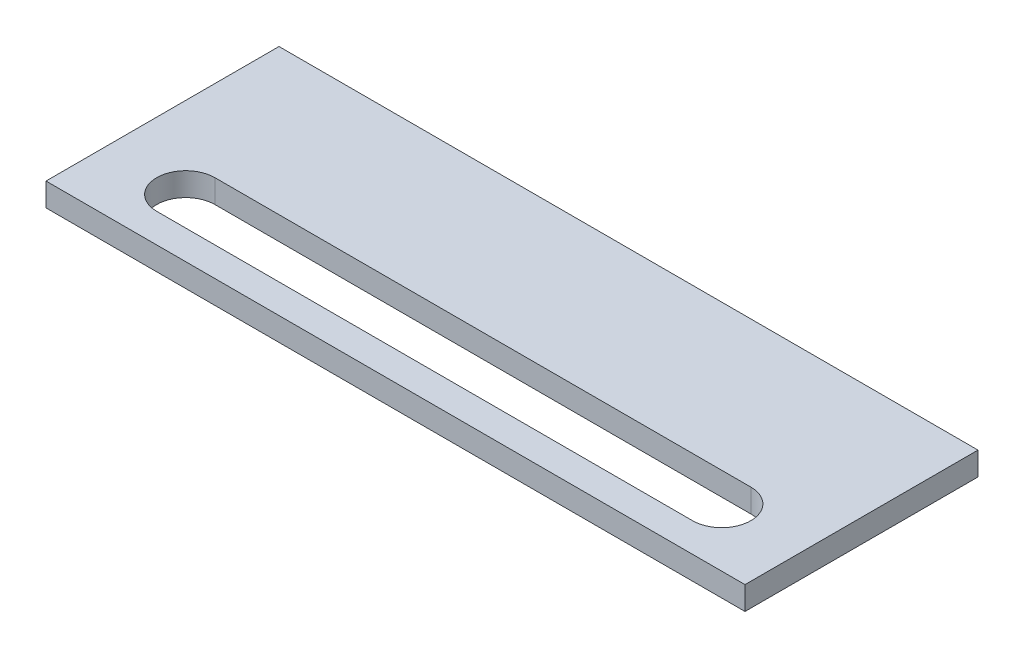
ISO-10303-21;
HEADER;
FILE_DESCRIPTION(('STEP AP214'),'2;1');
FILE_NAME('part.step','',(''),(''),'','','');
FILE_SCHEMA(('AUTOMOTIVE_DESIGN { 1 0 10303 214 1 1 1 1 }'));
ENDSEC;
DATA;
#1=APPLICATION_CONTEXT('core data for automotive mechanical design processes');
#2=APPLICATION_PROTOCOL_DEFINITION('international standard','automotive_design',2000,#1);
#3=PRODUCT_CONTEXT('',#1,'mechanical');
#4=PRODUCT('Part','Part','',(#3));
#5=PRODUCT_RELATED_PRODUCT_CATEGORY('part','',(#4));
#6=PRODUCT_DEFINITION_FORMATION('','',#4);
#7=PRODUCT_DEFINITION_CONTEXT('part definition',#1,'design');
#8=PRODUCT_DEFINITION('design','',#6,#7);
#9=PRODUCT_DEFINITION_SHAPE('','',#8);
#10=(LENGTH_UNIT() NAMED_UNIT(*) SI_UNIT(.MILLI.,.METRE.));
#11=(NAMED_UNIT(*) PLANE_ANGLE_UNIT() SI_UNIT($,.RADIAN.));
#12=(NAMED_UNIT(*) SI_UNIT($,.STERADIAN.) SOLID_ANGLE_UNIT());
#13=UNCERTAINTY_MEASURE_WITH_UNIT(LENGTH_MEASURE(1.E-05),#10,'distance_accuracy_value','');
#14=(GEOMETRIC_REPRESENTATION_CONTEXT(3) GLOBAL_UNCERTAINTY_ASSIGNED_CONTEXT((#13)) GLOBAL_UNIT_ASSIGNED_CONTEXT((#10,
#11,#12)) REPRESENTATION_CONTEXT('',''));
#15=CARTESIAN_POINT('',(0.,0.,0.));
#16=DIRECTION('',(0.,0.,1.));
#17=DIRECTION('',(1.,0.,0.));
#18=AXIS2_PLACEMENT_3D('',#15,#16,#17);
#19=CARTESIAN_POINT('',(0.,2.54,0.));
#20=DIRECTION('',(0.,1.,0.));
#21=DIRECTION('',(0.,0.,1.));
#22=AXIS2_PLACEMENT_3D('',#19,#20,#21);
#23=PLANE('',#22);
#24=DIRECTION('',(0.,0.,1.));
#25=VECTOR('',#24,1.);
#26=CARTESIAN_POINT('',(-38.1,2.54,0.));
#27=LINE('',#26,#25);
#28=CARTESIAN_POINT('',(-38.1,2.54,0.));
#29=VERTEX_POINT('',#28);
#30=CARTESIAN_POINT('',(-38.1,2.54,25.4));
#31=VERTEX_POINT('',#30);
#32=EDGE_CURVE('E153',#29,#31,#27,.T.);
#33=ORIENTED_EDGE('',*,*,#32,.T.);
#34=DIRECTION('',(1.,0.,0.));
#35=VECTOR('',#34,1.);
#36=CARTESIAN_POINT('',(-38.1,2.54,25.4));
#37=LINE('',#36,#35);
#38=CARTESIAN_POINT('',(38.1,2.54,25.4));
#39=VERTEX_POINT('',#38);
#40=EDGE_CURVE('E157',#31,#39,#37,.T.);
#41=ORIENTED_EDGE('',*,*,#40,.T.);
#42=DIRECTION('',(0.,0.,-1.));
#43=VECTOR('',#42,1.);
#44=CARTESIAN_POINT('',(38.1,2.54,0.));
#45=LINE('',#44,#43);
#46=CARTESIAN_POINT('',(38.1,2.54,0.));
#47=VERTEX_POINT('',#46);
#48=EDGE_CURVE('E161',#39,#47,#45,.T.);
#49=ORIENTED_EDGE('',*,*,#48,.T.);
#50=DIRECTION('',(-1.,0.,0.));
#51=VECTOR('',#50,1.);
#52=CARTESIAN_POINT('',(-38.1,2.54,0.));
#53=LINE('',#52,#51);
#54=EDGE_CURVE('E164',#47,#29,#53,.T.);
#55=ORIENTED_EDGE('',*,*,#54,.T.);
#56=EDGE_LOOP('',(#33,#41,#49,#55));
#57=FACE_BOUND('',#56,.T.);
#58=DIRECTION('',(1.,0.,0.));
#59=VECTOR('',#58,1.);
#60=CARTESIAN_POINT('',(-29.21,2.54,22.225));
#61=LINE('',#60,#59);
#62=CARTESIAN_POINT('',(-29.21,2.54,22.225));
#63=VERTEX_POINT('',#62);
#64=CARTESIAN_POINT('',(29.21,2.54,22.225));
#65=VERTEX_POINT('',#64);
#66=EDGE_CURVE('E114',#63,#65,#61,.T.);
#67=ORIENTED_EDGE('',*,*,#66,.F.);
#68=CARTESIAN_POINT('',(-29.21,2.54,19.05));
#69=DIRECTION('',(0.,1.,0.));
#70=DIRECTION('',(0.,0.,1.));
#71=AXIS2_PLACEMENT_3D('',#68,#69,#70);
#72=CIRCLE('',#71,3.175);
#73=CARTESIAN_POINT('',(-29.21,2.54,15.875));
#74=VERTEX_POINT('',#73);
#75=EDGE_CURVE('E105',#74,#63,#72,.T.);
#76=ORIENTED_EDGE('',*,*,#75,.F.);
#77=DIRECTION('',(-1.,0.,0.));
#78=VECTOR('',#77,1.);
#79=CARTESIAN_POINT('',(-29.21,2.54,15.875));
#80=LINE('',#79,#78);
#81=CARTESIAN_POINT('',(29.21,2.54,15.875));
#82=VERTEX_POINT('',#81);
#83=EDGE_CURVE('E131',#82,#74,#80,.T.);
#84=ORIENTED_EDGE('',*,*,#83,.F.);
#85=CARTESIAN_POINT('',(29.21,2.54,19.05));
#86=DIRECTION('',(0.,1.,0.));
#87=DIRECTION('',(0.,0.,1.));
#88=AXIS2_PLACEMENT_3D('',#85,#86,#87);
#89=CIRCLE('',#88,3.175);
#90=EDGE_CURVE('E127',#65,#82,#89,.T.);
#91=ORIENTED_EDGE('',*,*,#90,.F.);
#92=EDGE_LOOP('',(#67,#76,#84,#91));
#93=FACE_BOUND('',#92,.T.);
#94=ADVANCED_FACE('F39',(#57,#93),#23,.T.);
#95=CARTESIAN_POINT('',(0.,0.,0.));
#96=DIRECTION('',(0.,1.,0.));
#97=DIRECTION('',(0.,0.,1.));
#98=AXIS2_PLACEMENT_3D('',#95,#96,#97);
#99=PLANE('',#98);
#100=DIRECTION('',(0.,0.,1.));
#101=VECTOR('',#100,1.);
#102=CARTESIAN_POINT('',(-38.1,0.,0.));
#103=LINE('',#102,#101);
#104=CARTESIAN_POINT('',(-38.1,0.,0.));
#105=VERTEX_POINT('',#104);
#106=CARTESIAN_POINT('',(-38.1,0.,25.4));
#107=VERTEX_POINT('',#106);
#108=EDGE_CURVE('E123',#105,#107,#103,.T.);
#109=ORIENTED_EDGE('',*,*,#108,.F.);
#110=DIRECTION('',(-1.,0.,0.));
#111=VECTOR('',#110,1.);
#112=CARTESIAN_POINT('',(-38.1,0.,0.));
#113=LINE('',#112,#111);
#114=CARTESIAN_POINT('',(38.1,0.,0.));
#115=VERTEX_POINT('',#114);
#116=EDGE_CURVE('E158',#115,#105,#113,.T.);
#117=ORIENTED_EDGE('',*,*,#116,.F.);
#118=DIRECTION('',(0.,0.,-1.));
#119=VECTOR('',#118,1.);
#120=CARTESIAN_POINT('',(38.1,0.,0.));
#121=LINE('',#120,#119);
#122=CARTESIAN_POINT('',(38.1,0.,25.4));
#123=VERTEX_POINT('',#122);
#124=EDGE_CURVE('E174',#123,#115,#121,.T.);
#125=ORIENTED_EDGE('',*,*,#124,.F.);
#126=DIRECTION('',(1.,0.,0.));
#127=VECTOR('',#126,1.);
#128=CARTESIAN_POINT('',(-38.1,0.,25.4));
#129=LINE('',#128,#127);
#130=EDGE_CURVE('E171',#107,#123,#129,.T.);
#131=ORIENTED_EDGE('',*,*,#130,.F.);
#132=EDGE_LOOP('',(#109,#117,#125,#131));
#133=FACE_BOUND('',#132,.T.);
#134=CARTESIAN_POINT('',(-29.21,0.,19.05));
#135=DIRECTION('',(0.,1.,0.));
#136=DIRECTION('',(0.,0.,1.));
#137=AXIS2_PLACEMENT_3D('',#134,#135,#136);
#138=CIRCLE('',#137,3.175);
#139=CARTESIAN_POINT('',(-29.21,0.,15.875));
#140=VERTEX_POINT('',#139);
#141=CARTESIAN_POINT('',(-29.21,0.,22.225));
#142=VERTEX_POINT('',#141);
#143=EDGE_CURVE('E63',#140,#142,#138,.T.);
#144=ORIENTED_EDGE('',*,*,#143,.T.);
#145=DIRECTION('',(1.,0.,0.));
#146=VECTOR('',#145,1.);
#147=CARTESIAN_POINT('',(-29.21,0.,22.225));
#148=LINE('',#147,#146);
#149=CARTESIAN_POINT('',(29.21,0.,22.225));
#150=VERTEX_POINT('',#149);
#151=EDGE_CURVE('E121',#142,#150,#148,.T.);
#152=ORIENTED_EDGE('',*,*,#151,.T.);
#153=CARTESIAN_POINT('',(29.21,0.,19.05));
#154=DIRECTION('',(0.,1.,0.));
#155=DIRECTION('',(0.,0.,1.));
#156=AXIS2_PLACEMENT_3D('',#153,#154,#155);
#157=CIRCLE('',#156,3.175);
#158=CARTESIAN_POINT('',(29.21,0.,15.875));
#159=VERTEX_POINT('',#158);
#160=EDGE_CURVE('E140',#150,#159,#157,.T.);
#161=ORIENTED_EDGE('',*,*,#160,.T.);
#162=DIRECTION('',(-1.,0.,0.));
#163=VECTOR('',#162,1.);
#164=CARTESIAN_POINT('',(-29.21,0.,15.875));
#165=LINE('',#164,#163);
#166=EDGE_CURVE('E115',#159,#140,#165,.T.);
#167=ORIENTED_EDGE('',*,*,#166,.T.);
#168=EDGE_LOOP('',(#144,#152,#161,#167));
#169=FACE_BOUND('',#168,.T.);
#170=ADVANCED_FACE('F197',(#133,#169),#99,.F.);
#171=CARTESIAN_POINT('',(-38.1,2.54,0.));
#172=DIRECTION('',(1.,0.,0.));
#173=DIRECTION('',(0.,0.,-1.));
#174=AXIS2_PLACEMENT_3D('',#171,#172,#173);
#175=PLANE('',#174);
#176=ORIENTED_EDGE('',*,*,#108,.T.);
#177=DIRECTION('',(0.,-1.,0.));
#178=VECTOR('',#177,1.);
#179=CARTESIAN_POINT('',(-38.1,2.54,25.4));
#180=LINE('',#179,#178);
#181=EDGE_CURVE('E11',#31,#107,#180,.T.);
#182=ORIENTED_EDGE('',*,*,#181,.F.);
#183=ORIENTED_EDGE('',*,*,#32,.F.);
#184=DIRECTION('',(0.,-1.,0.));
#185=VECTOR('',#184,1.);
#186=CARTESIAN_POINT('',(-38.1,2.54,0.));
#187=LINE('',#186,#185);
#188=EDGE_CURVE('E167',#29,#105,#187,.T.);
#189=ORIENTED_EDGE('',*,*,#188,.T.);
#190=EDGE_LOOP('',(#176,#182,#183,#189));
#191=FACE_BOUND('',#190,.T.);
#192=ADVANCED_FACE('F41',(#191),#175,.F.);
#193=CARTESIAN_POINT('',(-38.1,2.54,25.4));
#194=DIRECTION('',(0.,0.,-1.));
#195=DIRECTION('',(-1.,0.,0.));
#196=AXIS2_PLACEMENT_3D('',#193,#194,#195);
#197=PLANE('',#196);
#198=ORIENTED_EDGE('',*,*,#130,.T.);
#199=DIRECTION('',(0.,-1.,0.));
#200=VECTOR('',#199,1.);
#201=CARTESIAN_POINT('',(38.1,2.54,25.4));
#202=LINE('',#201,#200);
#203=EDGE_CURVE('E48',#39,#123,#202,.T.);
#204=ORIENTED_EDGE('',*,*,#203,.F.);
#205=ORIENTED_EDGE('',*,*,#40,.F.);
#206=ORIENTED_EDGE('',*,*,#181,.T.);
#207=EDGE_LOOP('',(#198,#204,#205,#206));
#208=FACE_BOUND('',#207,.T.);
#209=ADVANCED_FACE('F207',(#208),#197,.F.);
#210=CARTESIAN_POINT('',(38.1,2.54,0.));
#211=DIRECTION('',(-1.,0.,0.));
#212=DIRECTION('',(0.,0.,1.));
#213=AXIS2_PLACEMENT_3D('',#210,#211,#212);
#214=PLANE('',#213);
#215=ORIENTED_EDGE('',*,*,#124,.T.);
#216=DIRECTION('',(0.,-1.,0.));
#217=VECTOR('',#216,1.);
#218=CARTESIAN_POINT('',(38.1,2.54,0.));
#219=LINE('',#218,#217);
#220=EDGE_CURVE('E182',#47,#115,#219,.T.);
#221=ORIENTED_EDGE('',*,*,#220,.F.);
#222=ORIENTED_EDGE('',*,*,#48,.F.);
#223=ORIENTED_EDGE('',*,*,#203,.T.);
#224=EDGE_LOOP('',(#215,#221,#222,#223));
#225=FACE_BOUND('',#224,.T.);
#226=ADVANCED_FACE('F191',(#225),#214,.F.);
#227=CARTESIAN_POINT('',(-38.1,2.54,0.));
#228=DIRECTION('',(0.,0.,1.));
#229=DIRECTION('',(1.,0.,0.));
#230=AXIS2_PLACEMENT_3D('',#227,#228,#229);
#231=PLANE('',#230);
#232=ORIENTED_EDGE('',*,*,#116,.T.);
#233=ORIENTED_EDGE('',*,*,#188,.F.);
#234=ORIENTED_EDGE('',*,*,#54,.F.);
#235=ORIENTED_EDGE('',*,*,#220,.T.);
#236=EDGE_LOOP('',(#232,#233,#234,#235));
#237=FACE_BOUND('',#236,.T.);
#238=ADVANCED_FACE('F201',(#237),#231,.F.);
#239=CARTESIAN_POINT('',(-29.21,2.54,19.05));
#240=DIRECTION('',(0.,-1.,0.));
#241=DIRECTION('',(0.,0.,-1.));
#242=AXIS2_PLACEMENT_3D('',#239,#240,#241);
#243=CYLINDRICAL_SURFACE('',#242,3.175);
#244=ORIENTED_EDGE('',*,*,#143,.F.);
#245=DIRECTION('',(0.,-1.,0.));
#246=VECTOR('',#245,1.);
#247=CARTESIAN_POINT('',(-29.21,2.54,15.875));
#248=LINE('',#247,#246);
#249=EDGE_CURVE('E109',#74,#140,#248,.T.);
#250=ORIENTED_EDGE('',*,*,#249,.F.);
#251=ORIENTED_EDGE('',*,*,#75,.T.);
#252=DIRECTION('',(0.,-1.,0.));
#253=VECTOR('',#252,1.);
#254=CARTESIAN_POINT('',(-29.21,2.54,22.225));
#255=LINE('',#254,#253);
#256=EDGE_CURVE('E108',#63,#142,#255,.T.);
#257=ORIENTED_EDGE('',*,*,#256,.T.);
#258=EDGE_LOOP('',(#244,#250,#251,#257));
#259=FACE_BOUND('',#258,.T.);
#260=ADVANCED_FACE('F107',(#259),#243,.F.);
#261=CARTESIAN_POINT('',(-29.21,2.54,22.225));
#262=DIRECTION('',(0.,0.,-1.));
#263=DIRECTION('',(-1.,0.,0.));
#264=AXIS2_PLACEMENT_3D('',#261,#262,#263);
#265=PLANE('',#264);
#266=ORIENTED_EDGE('',*,*,#151,.F.);
#267=ORIENTED_EDGE('',*,*,#256,.F.);
#268=ORIENTED_EDGE('',*,*,#66,.T.);
#269=DIRECTION('',(0.,-1.,0.));
#270=VECTOR('',#269,1.);
#271=CARTESIAN_POINT('',(29.21,2.54,22.225));
#272=LINE('',#271,#270);
#273=EDGE_CURVE('E124',#65,#150,#272,.T.);
#274=ORIENTED_EDGE('',*,*,#273,.T.);
#275=EDGE_LOOP('',(#266,#267,#268,#274));
#276=FACE_BOUND('',#275,.T.);
#277=ADVANCED_FACE('F118',(#276),#265,.T.);
#278=CARTESIAN_POINT('',(29.21,2.54,19.05));
#279=DIRECTION('',(0.,-1.,0.));
#280=DIRECTION('',(0.,0.,-1.));
#281=AXIS2_PLACEMENT_3D('',#278,#279,#280);
#282=CYLINDRICAL_SURFACE('',#281,3.175);
#283=ORIENTED_EDGE('',*,*,#160,.F.);
#284=ORIENTED_EDGE('',*,*,#273,.F.);
#285=ORIENTED_EDGE('',*,*,#90,.T.);
#286=DIRECTION('',(0.,-1.,0.));
#287=VECTOR('',#286,1.);
#288=CARTESIAN_POINT('',(29.21,2.54,15.875));
#289=LINE('',#288,#287);
#290=EDGE_CURVE('E55',#82,#159,#289,.T.);
#291=ORIENTED_EDGE('',*,*,#290,.T.);
#292=EDGE_LOOP('',(#283,#284,#285,#291));
#293=FACE_BOUND('',#292,.T.);
#294=ADVANCED_FACE('F230',(#293),#282,.F.);
#295=CARTESIAN_POINT('',(-29.21,2.54,15.875));
#296=DIRECTION('',(0.,0.,1.));
#297=DIRECTION('',(1.,0.,0.));
#298=AXIS2_PLACEMENT_3D('',#295,#296,#297);
#299=PLANE('',#298);
#300=ORIENTED_EDGE('',*,*,#166,.F.);
#301=ORIENTED_EDGE('',*,*,#290,.F.);
#302=ORIENTED_EDGE('',*,*,#83,.T.);
#303=ORIENTED_EDGE('',*,*,#249,.T.);
#304=EDGE_LOOP('',(#300,#301,#302,#303));
#305=FACE_BOUND('',#304,.T.);
#306=ADVANCED_FACE('F234',(#305),#299,.T.);
#307=CLOSED_SHELL('',(#94,#170,#192,#209,#226,#238,#260,#277,#294,#306));
#308=MANIFOLD_SOLID_BREP('B2',#307);
#309=ADVANCED_BREP_SHAPE_REPRESENTATION('',(#18,#308),#14);
#310=SHAPE_DEFINITION_REPRESENTATION(#9,#309);
ENDSEC;
END-ISO-10303-21;
